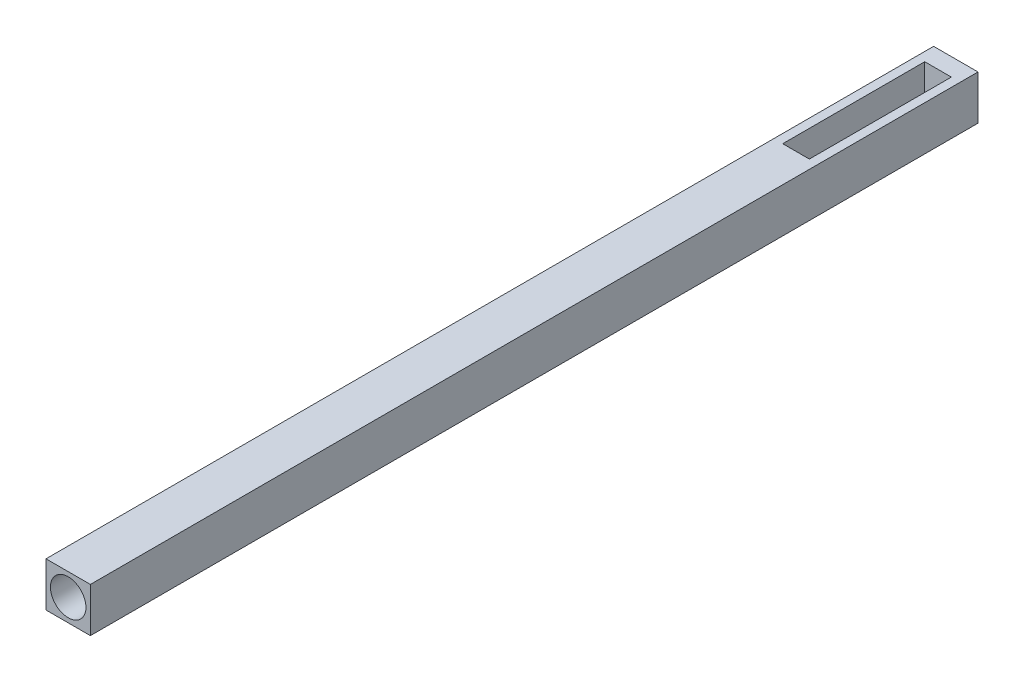
ISO-10303-21;
HEADER;
FILE_DESCRIPTION(('STEP AP214'),'2;1');
FILE_NAME('part.step','',(''),(''),'','','');
FILE_SCHEMA(('AUTOMOTIVE_DESIGN { 1 0 10303 214 1 1 1 1 }'));
ENDSEC;
DATA;
#1=APPLICATION_CONTEXT('core data for automotive mechanical design processes');
#2=APPLICATION_PROTOCOL_DEFINITION('international standard','automotive_design',2000,#1);
#3=PRODUCT_CONTEXT('',#1,'mechanical');
#4=PRODUCT('Part','Part','',(#3));
#5=PRODUCT_RELATED_PRODUCT_CATEGORY('part','',(#4));
#6=PRODUCT_DEFINITION_FORMATION('','',#4);
#7=PRODUCT_DEFINITION_CONTEXT('part definition',#1,'design');
#8=PRODUCT_DEFINITION('design','',#6,#7);
#9=PRODUCT_DEFINITION_SHAPE('','',#8);
#10=(LENGTH_UNIT() NAMED_UNIT(*) SI_UNIT(.MILLI.,.METRE.));
#11=(NAMED_UNIT(*) PLANE_ANGLE_UNIT() SI_UNIT($,.RADIAN.));
#12=(NAMED_UNIT(*) SI_UNIT($,.STERADIAN.) SOLID_ANGLE_UNIT());
#13=UNCERTAINTY_MEASURE_WITH_UNIT(LENGTH_MEASURE(1.E-05),#10,'distance_accuracy_value','');
#14=(GEOMETRIC_REPRESENTATION_CONTEXT(3) GLOBAL_UNCERTAINTY_ASSIGNED_CONTEXT((#13)) GLOBAL_UNIT_ASSIGNED_CONTEXT((#10,
#11,#12)) REPRESENTATION_CONTEXT('',''));
#15=CARTESIAN_POINT('',(0.,0.,0.));
#16=DIRECTION('',(0.,0.,1.));
#17=DIRECTION('',(1.,0.,0.));
#18=AXIS2_PLACEMENT_3D('',#15,#16,#17);
#19=CARTESIAN_POINT('',(0.952499999999996,3.175,-26.67));
#20=DIRECTION('',(0.,0.,-1.));
#21=DIRECTION('',(-1.,0.,0.));
#22=AXIS2_PLACEMENT_3D('',#19,#20,#21);
#23=PLANE('',#22);
#24=CARTESIAN_POINT('',(0.,1.5875,-26.67));
#25=DIRECTION('',(0.,0.,-1.));
#26=DIRECTION('',(-1.,0.,0.));
#27=AXIS2_PLACEMENT_3D('',#24,#25,#26);
#28=CIRCLE('',#27,1.27);
#29=CARTESIAN_POINT('',(0.952499999999996,2.42752604126302,-26.67));
#30=VERTEX_POINT('',#29);
#31=CARTESIAN_POINT('',(-0.952500000000004,2.427526041263,-26.67));
#32=VERTEX_POINT('',#31);
#33=EDGE_CURVE('E121',#30,#32,#28,.F.);
#34=ORIENTED_EDGE('',*,*,#33,.T.);
#35=DIRECTION('',(0.,-1.,0.));
#36=VECTOR('',#35,1.);
#37=CARTESIAN_POINT('',(-0.952500000000004,3.175,-26.67));
#38=LINE('',#37,#36);
#39=CARTESIAN_POINT('',(-0.952500000000004,3.175,-26.67));
#40=VERTEX_POINT('',#39);
#41=EDGE_CURVE('E137',#40,#32,#38,.T.);
#42=ORIENTED_EDGE('',*,*,#41,.F.);
#43=DIRECTION('',(1.,0.,0.));
#44=VECTOR('',#43,1.);
#45=CARTESIAN_POINT('',(0.952499999999996,3.175,-26.67));
#46=LINE('',#45,#44);
#47=CARTESIAN_POINT('',(0.952499999999996,3.175,-26.67));
#48=VERTEX_POINT('',#47);
#49=EDGE_CURVE('E150',#40,#48,#46,.T.);
#50=ORIENTED_EDGE('',*,*,#49,.T.);
#51=DIRECTION('',(0.,-1.,0.));
#52=VECTOR('',#51,1.);
#53=CARTESIAN_POINT('',(0.952499999999996,3.175,-26.67));
#54=LINE('',#53,#52);
#55=EDGE_CURVE('E138',#48,#30,#54,.T.);
#56=ORIENTED_EDGE('',*,*,#55,.T.);
#57=EDGE_LOOP('',(#34,#42,#50,#56));
#58=FACE_BOUND('',#57,.T.);
#59=ADVANCED_FACE('F38',(#58),#23,.T.);
#60=CARTESIAN_POINT('',(0.,3.175,0.));
#61=DIRECTION('',(0.,1.,0.));
#62=DIRECTION('',(0.,0.,1.));
#63=AXIS2_PLACEMENT_3D('',#60,#61,#62);
#64=PLANE('',#63);
#65=DIRECTION('',(0.,0.,-1.));
#66=VECTOR('',#65,1.);
#67=CARTESIAN_POINT('',(1.5875,3.175,-25.4));
#68=LINE('',#67,#66);
#69=CARTESIAN_POINT('',(1.5875,3.175,25.4));
#70=VERTEX_POINT('',#69);
#71=CARTESIAN_POINT('',(1.5875,3.175,-38.1));
#72=VERTEX_POINT('',#71);
#73=EDGE_CURVE('E172',#70,#72,#68,.T.);
#74=ORIENTED_EDGE('',*,*,#73,.T.);
#75=DIRECTION('',(-1.,0.,0.));
#76=VECTOR('',#75,1.);
#77=CARTESIAN_POINT('',(-1.5875,3.175,-38.1));
#78=LINE('',#77,#76);
#79=CARTESIAN_POINT('',(-1.5875,3.175,-38.1));
#80=VERTEX_POINT('',#79);
#81=EDGE_CURVE('E174',#72,#80,#78,.T.);
#82=ORIENTED_EDGE('',*,*,#81,.T.);
#83=DIRECTION('',(0.,0.,1.));
#84=VECTOR('',#83,1.);
#85=CARTESIAN_POINT('',(-1.5875,3.175,-25.4));
#86=LINE('',#85,#84);
#87=CARTESIAN_POINT('',(-1.5875,3.175,25.4));
#88=VERTEX_POINT('',#87);
#89=EDGE_CURVE('E177',#80,#88,#86,.T.);
#90=ORIENTED_EDGE('',*,*,#89,.T.);
#91=DIRECTION('',(1.,0.,0.));
#92=VECTOR('',#91,1.);
#93=CARTESIAN_POINT('',(-1.5875,3.175,25.4));
#94=LINE('',#93,#92);
#95=EDGE_CURVE('E179',#88,#70,#94,.T.);
#96=ORIENTED_EDGE('',*,*,#95,.T.);
#97=EDGE_LOOP('',(#74,#82,#90,#96));
#98=FACE_BOUND('',#97,.T.);
#99=ORIENTED_EDGE('',*,*,#49,.F.);
#100=DIRECTION('',(0.,0.,1.));
#101=VECTOR('',#100,1.);
#102=CARTESIAN_POINT('',(-0.952500000000004,3.175,-26.67));
#103=LINE('',#102,#101);
#104=CARTESIAN_POINT('',(-0.952500000000004,3.175,-36.83));
#105=VERTEX_POINT('',#104);
#106=EDGE_CURVE('E148',#105,#40,#103,.T.);
#107=ORIENTED_EDGE('',*,*,#106,.F.);
#108=DIRECTION('',(-1.,0.,0.));
#109=VECTOR('',#108,1.);
#110=CARTESIAN_POINT('',(0.952499999999996,3.175,-36.83));
#111=LINE('',#110,#109);
#112=CARTESIAN_POINT('',(0.952499999999996,3.175,-36.83));
#113=VERTEX_POINT('',#112);
#114=EDGE_CURVE('E155',#113,#105,#111,.T.);
#115=ORIENTED_EDGE('',*,*,#114,.F.);
#116=DIRECTION('',(0.,0.,-1.));
#117=VECTOR('',#116,1.);
#118=CARTESIAN_POINT('',(0.952499999999996,3.175,-26.67));
#119=LINE('',#118,#117);
#120=EDGE_CURVE('E153',#48,#113,#119,.T.);
#121=ORIENTED_EDGE('',*,*,#120,.F.);
#122=EDGE_LOOP('',(#99,#107,#115,#121));
#123=FACE_BOUND('',#122,.T.);
#124=ADVANCED_FACE('F216',(#98,#123),#64,.T.);
#125=CARTESIAN_POINT('',(0.,0.,0.));
#126=DIRECTION('',(0.,1.,0.));
#127=DIRECTION('',(0.,0.,1.));
#128=AXIS2_PLACEMENT_3D('',#125,#126,#127);
#129=PLANE('',#128);
#130=DIRECTION('',(0.,0.,-1.));
#131=VECTOR('',#130,1.);
#132=CARTESIAN_POINT('',(1.5875,0.,-25.4));
#133=LINE('',#132,#131);
#134=CARTESIAN_POINT('',(1.5875,0.,25.4));
#135=VERTEX_POINT('',#134);
#136=CARTESIAN_POINT('',(1.5875,0.,-38.1));
#137=VERTEX_POINT('',#136);
#138=EDGE_CURVE('E171',#135,#137,#133,.T.);
#139=ORIENTED_EDGE('',*,*,#138,.F.);
#140=DIRECTION('',(1.,0.,0.));
#141=VECTOR('',#140,1.);
#142=CARTESIAN_POINT('',(-1.5875,0.,25.4));
#143=LINE('',#142,#141);
#144=CARTESIAN_POINT('',(-1.5875,0.,25.4));
#145=VERTEX_POINT('',#144);
#146=EDGE_CURVE('E175',#145,#135,#143,.T.);
#147=ORIENTED_EDGE('',*,*,#146,.F.);
#148=DIRECTION('',(0.,0.,1.));
#149=VECTOR('',#148,1.);
#150=CARTESIAN_POINT('',(-1.5875,0.,-25.4));
#151=LINE('',#150,#149);
#152=CARTESIAN_POINT('',(-1.5875,0.,-38.1));
#153=VERTEX_POINT('',#152);
#154=EDGE_CURVE('E186',#153,#145,#151,.T.);
#155=ORIENTED_EDGE('',*,*,#154,.F.);
#156=DIRECTION('',(-1.,0.,0.));
#157=VECTOR('',#156,1.);
#158=CARTESIAN_POINT('',(-1.5875,0.,-38.1));
#159=LINE('',#158,#157);
#160=EDGE_CURVE('E183',#137,#153,#159,.T.);
#161=ORIENTED_EDGE('',*,*,#160,.F.);
#162=EDGE_LOOP('',(#139,#147,#155,#161));
#163=FACE_BOUND('',#162,.T.);
#164=DIRECTION('',(0.,0.,1.));
#165=VECTOR('',#164,1.);
#166=CARTESIAN_POINT('',(-0.952500000000004,0.,-26.67));
#167=LINE('',#166,#165);
#168=CARTESIAN_POINT('',(-0.952500000000004,0.,-36.83));
#169=VERTEX_POINT('',#168);
#170=CARTESIAN_POINT('',(-0.952500000000004,0.,-26.67));
#171=VERTEX_POINT('',#170);
#172=EDGE_CURVE('E143',#169,#171,#167,.T.);
#173=ORIENTED_EDGE('',*,*,#172,.T.);
#174=DIRECTION('',(1.,0.,0.));
#175=VECTOR('',#174,1.);
#176=CARTESIAN_POINT('',(0.952499999999996,0.,-26.67));
#177=LINE('',#176,#175);
#178=CARTESIAN_POINT('',(0.952499999999996,0.,-26.67));
#179=VERTEX_POINT('',#178);
#180=EDGE_CURVE('E134',#171,#179,#177,.T.);
#181=ORIENTED_EDGE('',*,*,#180,.T.);
#182=DIRECTION('',(0.,0.,-1.));
#183=VECTOR('',#182,1.);
#184=CARTESIAN_POINT('',(0.952499999999996,0.,-26.67));
#185=LINE('',#184,#183);
#186=CARTESIAN_POINT('',(0.952499999999996,0.,-36.83));
#187=VERTEX_POINT('',#186);
#188=EDGE_CURVE('E159',#179,#187,#185,.T.);
#189=ORIENTED_EDGE('',*,*,#188,.T.);
#190=DIRECTION('',(-1.,0.,0.));
#191=VECTOR('',#190,1.);
#192=CARTESIAN_POINT('',(0.952499999999996,0.,-36.83));
#193=LINE('',#192,#191);
#194=EDGE_CURVE('E151',#187,#169,#193,.T.);
#195=ORIENTED_EDGE('',*,*,#194,.T.);
#196=EDGE_LOOP('',(#173,#181,#189,#195));
#197=FACE_BOUND('',#196,.T.);
#198=ADVANCED_FACE('F206',(#163,#197),#129,.F.);
#199=CARTESIAN_POINT('',(1.5875,3.175,-25.4));
#200=DIRECTION('',(-1.,0.,0.));
#201=DIRECTION('',(0.,0.,1.));
#202=AXIS2_PLACEMENT_3D('',#199,#200,#201);
#203=PLANE('',#202);
#204=ORIENTED_EDGE('',*,*,#138,.T.);
#205=DIRECTION('',(0.,-1.,0.));
#206=VECTOR('',#205,1.);
#207=CARTESIAN_POINT('',(1.5875,3.175,-38.1));
#208=LINE('',#207,#206);
#209=EDGE_CURVE('E11',#72,#137,#208,.T.);
#210=ORIENTED_EDGE('',*,*,#209,.F.);
#211=ORIENTED_EDGE('',*,*,#73,.F.);
#212=DIRECTION('',(0.,-1.,0.));
#213=VECTOR('',#212,1.);
#214=CARTESIAN_POINT('',(1.5875,3.175,25.4));
#215=LINE('',#214,#213);
#216=EDGE_CURVE('E181',#70,#135,#215,.T.);
#217=ORIENTED_EDGE('',*,*,#216,.T.);
#218=EDGE_LOOP('',(#204,#210,#211,#217));
#219=FACE_BOUND('',#218,.T.);
#220=ADVANCED_FACE('F40',(#219),#203,.F.);
#221=CARTESIAN_POINT('',(-1.5875,3.175,-38.1));
#222=DIRECTION('',(0.,0.,1.));
#223=DIRECTION('',(1.,0.,0.));
#224=AXIS2_PLACEMENT_3D('',#221,#222,#223);
#225=PLANE('',#224);
#226=ORIENTED_EDGE('',*,*,#160,.T.);
#227=DIRECTION('',(0.,-1.,0.));
#228=VECTOR('',#227,1.);
#229=CARTESIAN_POINT('',(-1.5875,3.175,-38.1));
#230=LINE('',#229,#228);
#231=EDGE_CURVE('E46',#80,#153,#230,.T.);
#232=ORIENTED_EDGE('',*,*,#231,.F.);
#233=ORIENTED_EDGE('',*,*,#81,.F.);
#234=ORIENTED_EDGE('',*,*,#209,.T.);
#235=EDGE_LOOP('',(#226,#232,#233,#234));
#236=FACE_BOUND('',#235,.T.);
#237=ADVANCED_FACE('F202',(#236),#225,.F.);
#238=CARTESIAN_POINT('',(-1.5875,3.175,-25.4));
#239=DIRECTION('',(1.,0.,0.));
#240=DIRECTION('',(0.,0.,-1.));
#241=AXIS2_PLACEMENT_3D('',#238,#239,#240);
#242=PLANE('',#241);
#243=ORIENTED_EDGE('',*,*,#154,.T.);
#244=DIRECTION('',(0.,-1.,0.));
#245=VECTOR('',#244,1.);
#246=CARTESIAN_POINT('',(-1.5875,3.175,25.4));
#247=LINE('',#246,#245);
#248=EDGE_CURVE('E192',#88,#145,#247,.T.);
#249=ORIENTED_EDGE('',*,*,#248,.F.);
#250=ORIENTED_EDGE('',*,*,#89,.F.);
#251=ORIENTED_EDGE('',*,*,#231,.T.);
#252=EDGE_LOOP('',(#243,#249,#250,#251));
#253=FACE_BOUND('',#252,.T.);
#254=ADVANCED_FACE('F198',(#253),#242,.F.);
#255=CARTESIAN_POINT('',(-1.5875,3.175,25.4));
#256=DIRECTION('',(0.,0.,-1.));
#257=DIRECTION('',(-1.,0.,0.));
#258=AXIS2_PLACEMENT_3D('',#255,#256,#257);
#259=PLANE('',#258);
#260=CARTESIAN_POINT('',(0.,1.5875,25.4));
#261=DIRECTION('',(0.,0.,1.));
#262=DIRECTION('',(1.,0.,0.));
#263=AXIS2_PLACEMENT_3D('',#260,#261,#262);
#264=CIRCLE('',#263,1.27);
#265=CARTESIAN_POINT('',(1.27,1.5875,25.4));
#266=VERTEX_POINT('',#265);
#267=EDGE_CURVE('E122',#266,#266,#264,.T.);
#268=ORIENTED_EDGE('',*,*,#267,.F.);
#269=EDGE_LOOP('',(#268));
#270=FACE_BOUND('',#269,.T.);
#271=ORIENTED_EDGE('',*,*,#146,.T.);
#272=ORIENTED_EDGE('',*,*,#216,.F.);
#273=ORIENTED_EDGE('',*,*,#95,.F.);
#274=ORIENTED_EDGE('',*,*,#248,.T.);
#275=EDGE_LOOP('',(#271,#272,#273,#274));
#276=FACE_BOUND('',#275,.T.);
#277=ADVANCED_FACE('F211',(#270,#276),#259,.F.);
#278=CARTESIAN_POINT('',(-0.952500000000004,3.175,-26.67));
#279=DIRECTION('',(1.,0.,0.));
#280=DIRECTION('',(0.,0.,-1.));
#281=AXIS2_PLACEMENT_3D('',#278,#279,#280);
#282=PLANE('',#281);
#283=ORIENTED_EDGE('',*,*,#172,.F.);
#284=DIRECTION('',(0.,-1.,0.));
#285=VECTOR('',#284,1.);
#286=CARTESIAN_POINT('',(-0.952500000000004,3.175,-36.83));
#287=LINE('',#286,#285);
#288=EDGE_CURVE('E156',#105,#169,#287,.T.);
#289=ORIENTED_EDGE('',*,*,#288,.F.);
#290=ORIENTED_EDGE('',*,*,#106,.T.);
#291=ORIENTED_EDGE('',*,*,#41,.T.);
#292=DIRECTION('',(0.,1.,0.));
#293=VECTOR('',#292,1.);
#294=CARTESIAN_POINT('',(-0.952500000000004,3.175,-26.67));
#295=LINE('',#294,#293);
#296=CARTESIAN_POINT('',(-0.952500000000004,0.747473958736999,-26.67));
#297=VERTEX_POINT('',#296);
#298=EDGE_CURVE('E118',#297,#32,#295,.T.);
#299=ORIENTED_EDGE('',*,*,#298,.F.);
#300=EDGE_CURVE('E131',#297,#171,#38,.T.);
#301=ORIENTED_EDGE('',*,*,#300,.T.);
#302=EDGE_LOOP('',(#283,#289,#290,#291,#299,#301));
#303=FACE_BOUND('',#302,.T.);
#304=ADVANCED_FACE('F141',(#303),#282,.T.);
#305=CARTESIAN_POINT('',(0.952499999999996,0.747473958736986,-26.67));
#306=VERTEX_POINT('',#305);
#307=EDGE_CURVE('E124',#297,#306,#28,.F.);
#308=ORIENTED_EDGE('',*,*,#307,.T.);
#309=EDGE_CURVE('E167',#306,#179,#54,.T.);
#310=ORIENTED_EDGE('',*,*,#309,.T.);
#311=ORIENTED_EDGE('',*,*,#180,.F.);
#312=ORIENTED_EDGE('',*,*,#300,.F.);
#313=EDGE_LOOP('',(#308,#310,#311,#312));
#314=FACE_BOUND('',#313,.T.);
#315=ADVANCED_FACE('F132',(#314),#23,.T.);
#316=CARTESIAN_POINT('',(0.952499999999996,3.175,-26.67));
#317=DIRECTION('',(-1.,0.,0.));
#318=DIRECTION('',(0.,0.,1.));
#319=AXIS2_PLACEMENT_3D('',#316,#317,#318);
#320=PLANE('',#319);
#321=ORIENTED_EDGE('',*,*,#188,.F.);
#322=ORIENTED_EDGE('',*,*,#309,.F.);
#323=EDGE_CURVE('E169',#30,#306,#54,.T.);
#324=ORIENTED_EDGE('',*,*,#323,.F.);
#325=ORIENTED_EDGE('',*,*,#55,.F.);
#326=ORIENTED_EDGE('',*,*,#120,.T.);
#327=DIRECTION('',(0.,-1.,0.));
#328=VECTOR('',#327,1.);
#329=CARTESIAN_POINT('',(0.952499999999996,3.175,-36.83));
#330=LINE('',#329,#328);
#331=EDGE_CURVE('E60',#113,#187,#330,.T.);
#332=ORIENTED_EDGE('',*,*,#331,.T.);
#333=EDGE_LOOP('',(#321,#322,#324,#325,#326,#332));
#334=FACE_BOUND('',#333,.T.);
#335=ADVANCED_FACE('F229',(#334),#320,.T.);
#336=CARTESIAN_POINT('',(0.952499999999996,3.175,-36.83));
#337=DIRECTION('',(0.,0.,1.));
#338=DIRECTION('',(1.,0.,0.));
#339=AXIS2_PLACEMENT_3D('',#336,#337,#338);
#340=PLANE('',#339);
#341=ORIENTED_EDGE('',*,*,#194,.F.);
#342=ORIENTED_EDGE('',*,*,#331,.F.);
#343=ORIENTED_EDGE('',*,*,#114,.T.);
#344=ORIENTED_EDGE('',*,*,#288,.T.);
#345=EDGE_LOOP('',(#341,#342,#343,#344));
#346=FACE_BOUND('',#345,.T.);
#347=ADVANCED_FACE('F231',(#346),#340,.T.);
#348=CARTESIAN_POINT('',(0.952499999999996,3.175,-26.67));
#349=DIRECTION('',(0.,0.,-1.));
#350=DIRECTION('',(-1.,0.,0.));
#351=AXIS2_PLACEMENT_3D('',#348,#349,#350);
#352=PLANE('',#351);
#353=ORIENTED_EDGE('',*,*,#298,.T.);
#354=EDGE_CURVE('E114',#32,#297,#28,.F.);
#355=ORIENTED_EDGE('',*,*,#354,.T.);
#356=EDGE_LOOP('',(#353,#355));
#357=FACE_BOUND('',#356,.T.);
#358=ADVANCED_FACE('F116',(#357),#352,.F.);
#359=ORIENTED_EDGE('',*,*,#323,.T.);
#360=EDGE_CURVE('E52',#306,#30,#28,.F.);
#361=ORIENTED_EDGE('',*,*,#360,.T.);
#362=EDGE_LOOP('',(#359,#361));
#363=FACE_BOUND('',#362,.T.);
#364=ADVANCED_FACE('F238',(#363),#352,.F.);
#365=CARTESIAN_POINT('',(0.,1.5875,-30.2621024484277));
#366=DIRECTION('',(0.,0.,1.));
#367=DIRECTION('',(1.,0.,0.));
#368=AXIS2_PLACEMENT_3D('',#365,#366,#367);
#369=CYLINDRICAL_SURFACE('',#368,1.27);
#370=ORIENTED_EDGE('',*,*,#267,.T.);
#371=EDGE_LOOP('',(#370));
#372=FACE_BOUND('',#371,.T.);
#373=ORIENTED_EDGE('',*,*,#307,.F.);
#374=ORIENTED_EDGE('',*,*,#354,.F.);
#375=ORIENTED_EDGE('',*,*,#33,.F.);
#376=ORIENTED_EDGE('',*,*,#360,.F.);
#377=EDGE_LOOP('',(#373,#374,#375,#376));
#378=FACE_BOUND('',#377,.T.);
#379=ADVANCED_FACE('F127',(#372,#378),#369,.F.);
#380=CLOSED_SHELL('',(#59,#124,#198,#220,#237,#254,#277,#304,#315,#335,#347,#358,#364,#379));
#381=MANIFOLD_SOLID_BREP('B2',#380);
#382=ADVANCED_BREP_SHAPE_REPRESENTATION('',(#18,#381),#14);
#383=SHAPE_DEFINITION_REPRESENTATION(#9,#382);
ENDSEC;
END-ISO-10303-21;
